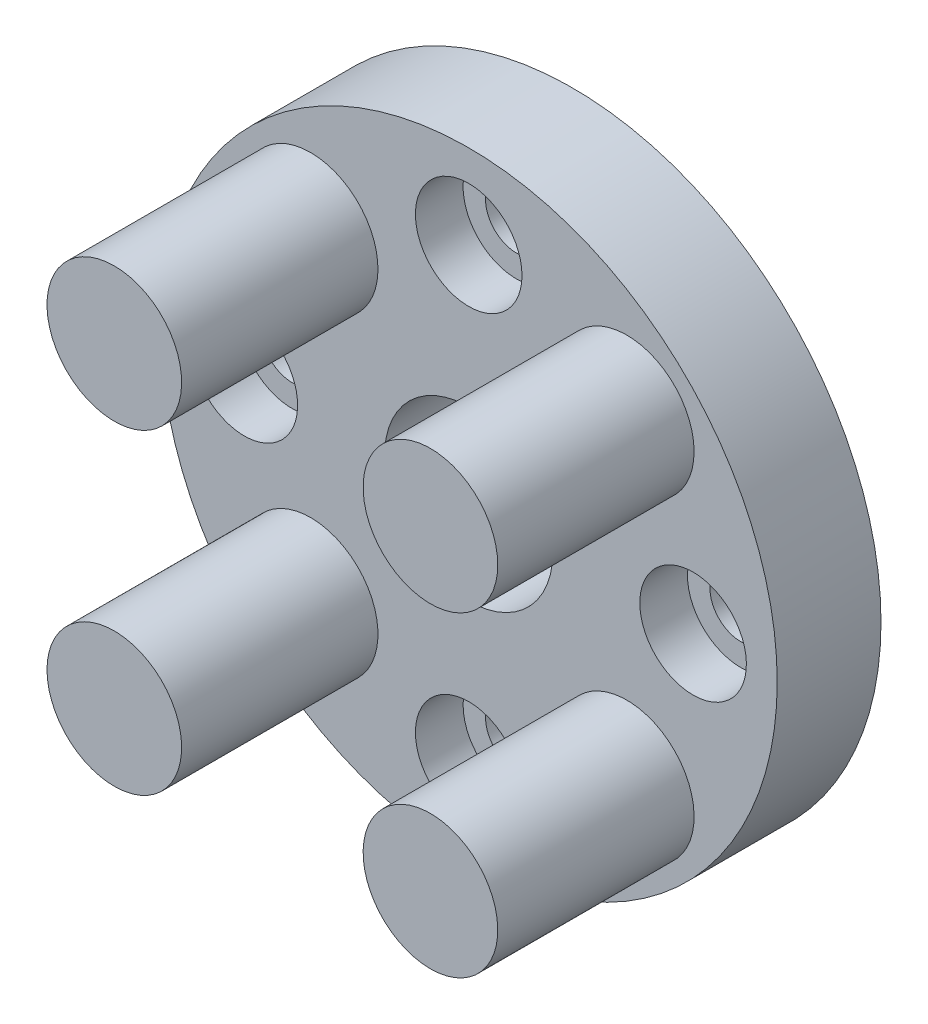
ISO-10303-21;
HEADER;
FILE_DESCRIPTION(('STEP AP214'),'2;1');
FILE_NAME('part.step','',(''),(''),'','','');
FILE_SCHEMA(('AUTOMOTIVE_DESIGN { 1 0 10303 214 1 1 1 1 }'));
ENDSEC;
DATA;
#1=APPLICATION_CONTEXT('core data for automotive mechanical design processes');
#2=APPLICATION_PROTOCOL_DEFINITION('international standard','automotive_design',2000,#1);
#3=PRODUCT_CONTEXT('',#1,'mechanical');
#4=PRODUCT('Part','Part','',(#3));
#5=PRODUCT_RELATED_PRODUCT_CATEGORY('part','',(#4));
#6=PRODUCT_DEFINITION_FORMATION('','',#4);
#7=PRODUCT_DEFINITION_CONTEXT('part definition',#1,'design');
#8=PRODUCT_DEFINITION('design','',#6,#7);
#9=PRODUCT_DEFINITION_SHAPE('','',#8);
#10=(LENGTH_UNIT() NAMED_UNIT(*) SI_UNIT(.MILLI.,.METRE.));
#11=(NAMED_UNIT(*) PLANE_ANGLE_UNIT() SI_UNIT($,.RADIAN.));
#12=(NAMED_UNIT(*) SI_UNIT($,.STERADIAN.) SOLID_ANGLE_UNIT());
#13=UNCERTAINTY_MEASURE_WITH_UNIT(LENGTH_MEASURE(1.E-05),#10,'distance_accuracy_value','');
#14=(GEOMETRIC_REPRESENTATION_CONTEXT(3) GLOBAL_UNCERTAINTY_ASSIGNED_CONTEXT((#13)) GLOBAL_UNIT_ASSIGNED_CONTEXT((#10,
#11,#12)) REPRESENTATION_CONTEXT('',''));
#15=CARTESIAN_POINT('',(0.,0.,0.));
#16=DIRECTION('',(0.,0.,1.));
#17=DIRECTION('',(1.,0.,0.));
#18=AXIS2_PLACEMENT_3D('',#15,#16,#17);
#19=CARTESIAN_POINT('',(8.,0.,3.7));
#20=DIRECTION('',(0.,0.,-1.));
#21=DIRECTION('',(-1.,0.,0.));
#22=AXIS2_PLACEMENT_3D('',#19,#20,#21);
#23=CYLINDRICAL_SURFACE('',#22,1.1);
#24=CARTESIAN_POINT('',(8.,0.,0.));
#25=DIRECTION('',(0.,0.,1.));
#26=DIRECTION('',(1.,0.,0.));
#27=AXIS2_PLACEMENT_3D('',#24,#25,#26);
#28=CIRCLE('',#27,1.1);
#29=CARTESIAN_POINT('',(9.1,0.,0.));
#30=VERTEX_POINT('',#29);
#31=EDGE_CURVE('E106',#30,#30,#28,.T.);
#32=ORIENTED_EDGE('',*,*,#31,.F.);
#33=EDGE_LOOP('',(#32));
#34=FACE_BOUND('',#33,.T.);
#35=CARTESIAN_POINT('',(8.,0.,2.));
#36=DIRECTION('',(0.,0.,1.));
#37=DIRECTION('',(1.,0.,0.));
#38=AXIS2_PLACEMENT_3D('',#35,#36,#37);
#39=CIRCLE('',#38,1.1);
#40=CARTESIAN_POINT('',(9.1,0.,2.));
#41=VERTEX_POINT('',#40);
#42=EDGE_CURVE('E43',#41,#41,#39,.T.);
#43=ORIENTED_EDGE('',*,*,#42,.T.);
#44=EDGE_LOOP('',(#43));
#45=FACE_BOUND('',#44,.T.);
#46=ADVANCED_FACE('F39',(#34,#45),#23,.F.);
#47=CARTESIAN_POINT('',(0.,-8.,3.7));
#48=DIRECTION('',(0.,0.,-1.));
#49=DIRECTION('',(-1.,0.,0.));
#50=AXIS2_PLACEMENT_3D('',#47,#48,#49);
#51=CYLINDRICAL_SURFACE('',#50,1.1);
#52=CARTESIAN_POINT('',(0.,-8.,0.));
#53=DIRECTION('',(0.,0.,1.));
#54=DIRECTION('',(1.,0.,0.));
#55=AXIS2_PLACEMENT_3D('',#52,#53,#54);
#56=CIRCLE('',#55,1.1);
#57=CARTESIAN_POINT('',(1.1,-8.,0.));
#58=VERTEX_POINT('',#57);
#59=EDGE_CURVE('E98',#58,#58,#56,.T.);
#60=ORIENTED_EDGE('',*,*,#59,.F.);
#61=EDGE_LOOP('',(#60));
#62=FACE_BOUND('',#61,.T.);
#63=CARTESIAN_POINT('',(0.,-8.,2.));
#64=DIRECTION('',(0.,0.,1.));
#65=DIRECTION('',(1.,0.,0.));
#66=AXIS2_PLACEMENT_3D('',#63,#64,#65);
#67=CIRCLE('',#66,1.1);
#68=CARTESIAN_POINT('',(1.1,-8.,2.));
#69=VERTEX_POINT('',#68);
#70=EDGE_CURVE('E126',#69,#69,#67,.T.);
#71=ORIENTED_EDGE('',*,*,#70,.T.);
#72=EDGE_LOOP('',(#71));
#73=FACE_BOUND('',#72,.T.);
#74=ADVANCED_FACE('F188',(#62,#73),#51,.F.);
#75=CARTESIAN_POINT('',(-8.,0.,3.7));
#76=DIRECTION('',(0.,0.,-1.));
#77=DIRECTION('',(-1.,0.,0.));
#78=AXIS2_PLACEMENT_3D('',#75,#76,#77);
#79=CYLINDRICAL_SURFACE('',#78,1.1);
#80=CARTESIAN_POINT('',(-8.,0.,0.));
#81=DIRECTION('',(0.,0.,1.));
#82=DIRECTION('',(1.,0.,0.));
#83=AXIS2_PLACEMENT_3D('',#80,#81,#82);
#84=CIRCLE('',#83,1.1);
#85=CARTESIAN_POINT('',(-6.9,0.,0.));
#86=VERTEX_POINT('',#85);
#87=EDGE_CURVE('E94',#86,#86,#84,.T.);
#88=ORIENTED_EDGE('',*,*,#87,.F.);
#89=EDGE_LOOP('',(#88));
#90=FACE_BOUND('',#89,.T.);
#91=CARTESIAN_POINT('',(-8.,0.,2.));
#92=DIRECTION('',(0.,0.,1.));
#93=DIRECTION('',(1.,0.,0.));
#94=AXIS2_PLACEMENT_3D('',#91,#92,#93);
#95=CIRCLE('',#94,1.1);
#96=CARTESIAN_POINT('',(-6.9,0.,2.));
#97=VERTEX_POINT('',#96);
#98=EDGE_CURVE('E64',#97,#97,#95,.T.);
#99=ORIENTED_EDGE('',*,*,#98,.T.);
#100=EDGE_LOOP('',(#99));
#101=FACE_BOUND('',#100,.T.);
#102=ADVANCED_FACE('F185',(#90,#101),#79,.F.);
#103=CARTESIAN_POINT('',(0.,8.,3.7));
#104=DIRECTION('',(0.,0.,-1.));
#105=DIRECTION('',(-1.,0.,0.));
#106=AXIS2_PLACEMENT_3D('',#103,#104,#105);
#107=CYLINDRICAL_SURFACE('',#106,1.1);
#108=CARTESIAN_POINT('',(0.,8.,0.));
#109=DIRECTION('',(0.,0.,1.));
#110=DIRECTION('',(1.,0.,0.));
#111=AXIS2_PLACEMENT_3D('',#108,#109,#110);
#112=CIRCLE('',#111,1.1);
#113=CARTESIAN_POINT('',(1.1,8.,0.));
#114=VERTEX_POINT('',#113);
#115=EDGE_CURVE('E102',#114,#114,#112,.T.);
#116=ORIENTED_EDGE('',*,*,#115,.F.);
#117=EDGE_LOOP('',(#116));
#118=FACE_BOUND('',#117,.T.);
#119=CARTESIAN_POINT('',(0.,8.,2.));
#120=DIRECTION('',(0.,0.,1.));
#121=DIRECTION('',(1.,0.,0.));
#122=AXIS2_PLACEMENT_3D('',#119,#120,#121);
#123=CIRCLE('',#122,1.1);
#124=CARTESIAN_POINT('',(1.1,8.,2.));
#125=VERTEX_POINT('',#124);
#126=EDGE_CURVE('E89',#125,#125,#123,.T.);
#127=ORIENTED_EDGE('',*,*,#126,.T.);
#128=EDGE_LOOP('',(#127));
#129=FACE_BOUND('',#128,.T.);
#130=ADVANCED_FACE('F154',(#118,#129),#107,.F.);
#131=CARTESIAN_POINT('',(0.,0.,3.7));
#132=DIRECTION('',(0.,0.,1.));
#133=DIRECTION('',(1.,0.,0.));
#134=AXIS2_PLACEMENT_3D('',#131,#132,#133);
#135=PLANE('',#134);
#136=CARTESIAN_POINT('',(-5.63564104605673,5.63564104605683,3.7));
#137=DIRECTION('',(0.,0.,1.));
#138=DIRECTION('',(0.,1.,0.));
#139=AXIS2_PLACEMENT_3D('',#136,#137,#138);
#140=CIRCLE('',#139,2.4);
#141=CARTESIAN_POINT('',(-5.63564104605671,8.03564104605683,3.7));
#142=VERTEX_POINT('',#141);
#143=EDGE_CURVE('E387',#142,#142,#140,.T.);
#144=ORIENTED_EDGE('',*,*,#143,.F.);
#145=EDGE_LOOP('',(#144));
#146=FACE_BOUND('',#145,.T.);
#147=CARTESIAN_POINT('',(-5.63564104605677,-5.63564104605679,3.7));
#148=DIRECTION('',(0.,0.,1.));
#149=DIRECTION('',(-1.,0.,0.));
#150=AXIS2_PLACEMENT_3D('',#147,#148,#149);
#151=CIRCLE('',#150,2.4);
#152=CARTESIAN_POINT('',(-8.03564104605677,-5.63564104605679,3.7));
#153=VERTEX_POINT('',#152);
#154=EDGE_CURVE('E386',#153,#153,#151,.T.);
#155=ORIENTED_EDGE('',*,*,#154,.F.);
#156=EDGE_LOOP('',(#155));
#157=FACE_BOUND('',#156,.T.);
#158=CARTESIAN_POINT('',(5.63564104605677,-5.63564104605679,3.7));
#159=DIRECTION('',(0.,0.,1.));
#160=DIRECTION('',(0.,-1.,0.));
#161=AXIS2_PLACEMENT_3D('',#158,#159,#160);
#162=CIRCLE('',#161,2.4);
#163=CARTESIAN_POINT('',(5.63564104605677,-8.03564104605679,3.7));
#164=VERTEX_POINT('',#163);
#165=EDGE_CURVE('E399',#164,#164,#162,.T.);
#166=ORIENTED_EDGE('',*,*,#165,.F.);
#167=EDGE_LOOP('',(#166));
#168=FACE_BOUND('',#167,.T.);
#169=CARTESIAN_POINT('',(5.63564104605677,5.63564104605679,3.7));
#170=DIRECTION('',(0.,0.,1.));
#171=DIRECTION('',(1.,0.,0.));
#172=AXIS2_PLACEMENT_3D('',#169,#170,#171);
#173=CIRCLE('',#172,2.4);
#174=CARTESIAN_POINT('',(8.03564104605677,5.63564104605679,3.7));
#175=VERTEX_POINT('',#174);
#176=EDGE_CURVE('E10',#175,#175,#173,.T.);
#177=ORIENTED_EDGE('',*,*,#176,.F.);
#178=EDGE_LOOP('',(#177));
#179=FACE_BOUND('',#178,.T.);
#180=CARTESIAN_POINT('',(8.,0.,3.7));
#181=DIRECTION('',(0.,0.,1.));
#182=DIRECTION('',(0.,-1.,0.));
#183=AXIS2_PLACEMENT_3D('',#180,#181,#182);
#184=CIRCLE('',#183,1.9);
#185=CARTESIAN_POINT('',(7.99999999999999,-1.90000000000003,3.7));
#186=VERTEX_POINT('',#185);
#187=EDGE_CURVE('E65',#186,#186,#184,.T.);
#188=ORIENTED_EDGE('',*,*,#187,.F.);
#189=EDGE_LOOP('',(#188));
#190=FACE_BOUND('',#189,.T.);
#191=CARTESIAN_POINT('',(0.,-8.,3.7));
#192=DIRECTION('',(0.,0.,1.));
#193=DIRECTION('',(-1.,0.,0.));
#194=AXIS2_PLACEMENT_3D('',#191,#192,#193);
#195=CIRCLE('',#194,1.9);
#196=CARTESIAN_POINT('',(-1.9,-8.,3.7));
#197=VERTEX_POINT('',#196);
#198=EDGE_CURVE('E73',#197,#197,#195,.T.);
#199=ORIENTED_EDGE('',*,*,#198,.F.);
#200=EDGE_LOOP('',(#199));
#201=FACE_BOUND('',#200,.T.);
#202=CARTESIAN_POINT('',(-8.,0.,3.7));
#203=DIRECTION('',(0.,0.,1.));
#204=DIRECTION('',(0.,1.,0.));
#205=AXIS2_PLACEMENT_3D('',#202,#203,#204);
#206=CIRCLE('',#205,1.9);
#207=CARTESIAN_POINT('',(-7.99999999999998,1.90000000000008,3.7));
#208=VERTEX_POINT('',#207);
#209=EDGE_CURVE('E81',#208,#208,#206,.T.);
#210=ORIENTED_EDGE('',*,*,#209,.F.);
#211=EDGE_LOOP('',(#210));
#212=FACE_BOUND('',#211,.T.);
#213=CARTESIAN_POINT('',(0.,8.,3.7));
#214=DIRECTION('',(0.,0.,1.));
#215=DIRECTION('',(1.,0.,0.));
#216=AXIS2_PLACEMENT_3D('',#213,#214,#215);
#217=CIRCLE('',#216,1.9);
#218=CARTESIAN_POINT('',(1.9,8.,3.7));
#219=VERTEX_POINT('',#218);
#220=EDGE_CURVE('E90',#219,#219,#217,.T.);
#221=ORIENTED_EDGE('',*,*,#220,.F.);
#222=EDGE_LOOP('',(#221));
#223=FACE_BOUND('',#222,.T.);
#224=CARTESIAN_POINT('',(0.,0.,3.7));
#225=DIRECTION('',(0.,0.,1.));
#226=DIRECTION('',(1.,0.,0.));
#227=AXIS2_PLACEMENT_3D('',#224,#225,#226);
#228=CIRCLE('',#227,11.);
#229=CARTESIAN_POINT('',(11.,0.,3.7));
#230=VERTEX_POINT('',#229);
#231=EDGE_CURVE('E48',#230,#230,#228,.T.);
#232=ORIENTED_EDGE('',*,*,#231,.T.);
#233=EDGE_LOOP('',(#232));
#234=FACE_BOUND('',#233,.T.);
#235=CARTESIAN_POINT('',(0.,0.,3.7));
#236=DIRECTION('',(0.,0.,1.));
#237=DIRECTION('',(1.,0.,0.));
#238=AXIS2_PLACEMENT_3D('',#235,#236,#237);
#239=CIRCLE('',#238,3.);
#240=CARTESIAN_POINT('',(3.,0.,3.7));
#241=VERTEX_POINT('',#240);
#242=EDGE_CURVE('E111',#241,#241,#239,.T.);
#243=ORIENTED_EDGE('',*,*,#242,.F.);
#244=EDGE_LOOP('',(#243));
#245=FACE_BOUND('',#244,.T.);
#246=ADVANCED_FACE('F150',(#146,#157,#168,#179,#190,#201,#212,#223,#234,#245),#135,.T.);
#247=CARTESIAN_POINT('',(0.,0.,0.));
#248=DIRECTION('',(0.,0.,1.));
#249=DIRECTION('',(1.,0.,0.));
#250=AXIS2_PLACEMENT_3D('',#247,#248,#249);
#251=PLANE('',#250);
#252=CARTESIAN_POINT('',(0.,0.,0.));
#253=DIRECTION('',(0.,0.,1.));
#254=DIRECTION('',(1.,0.,0.));
#255=AXIS2_PLACEMENT_3D('',#252,#253,#254);
#256=CIRCLE('',#255,11.);
#257=CARTESIAN_POINT('',(11.,0.,0.));
#258=VERTEX_POINT('',#257);
#259=EDGE_CURVE('E54',#258,#258,#256,.T.);
#260=ORIENTED_EDGE('',*,*,#259,.F.);
#261=EDGE_LOOP('',(#260));
#262=FACE_BOUND('',#261,.T.);
#263=CARTESIAN_POINT('',(0.,0.,0.));
#264=DIRECTION('',(0.,0.,1.));
#265=DIRECTION('',(1.,0.,0.));
#266=AXIS2_PLACEMENT_3D('',#263,#264,#265);
#267=CIRCLE('',#266,3.);
#268=CARTESIAN_POINT('',(3.,0.,0.));
#269=VERTEX_POINT('',#268);
#270=EDGE_CURVE('E110',#269,#269,#267,.T.);
#271=ORIENTED_EDGE('',*,*,#270,.T.);
#272=EDGE_LOOP('',(#271));
#273=FACE_BOUND('',#272,.T.);
#274=ORIENTED_EDGE('',*,*,#31,.T.);
#275=EDGE_LOOP('',(#274));
#276=FACE_BOUND('',#275,.T.);
#277=ORIENTED_EDGE('',*,*,#115,.T.);
#278=EDGE_LOOP('',(#277));
#279=FACE_BOUND('',#278,.T.);
#280=ORIENTED_EDGE('',*,*,#59,.T.);
#281=EDGE_LOOP('',(#280));
#282=FACE_BOUND('',#281,.T.);
#283=ORIENTED_EDGE('',*,*,#87,.T.);
#284=EDGE_LOOP('',(#283));
#285=FACE_BOUND('',#284,.T.);
#286=ADVANCED_FACE('F153',(#262,#273,#276,#279,#282,#285),#251,.F.);
#287=CARTESIAN_POINT('',(0.,0.,3.7));
#288=DIRECTION('',(0.,0.,-1.));
#289=DIRECTION('',(-1.,0.,0.));
#290=AXIS2_PLACEMENT_3D('',#287,#288,#289);
#291=CYLINDRICAL_SURFACE('',#290,11.);
#292=ORIENTED_EDGE('',*,*,#231,.F.);
#293=EDGE_LOOP('',(#292));
#294=FACE_BOUND('',#293,.T.);
#295=ORIENTED_EDGE('',*,*,#259,.T.);
#296=EDGE_LOOP('',(#295));
#297=FACE_BOUND('',#296,.T.);
#298=ADVANCED_FACE('F41',(#294,#297),#291,.T.);
#299=CARTESIAN_POINT('',(0.,0.,3.7));
#300=DIRECTION('',(0.,0.,-1.));
#301=DIRECTION('',(-1.,0.,0.));
#302=AXIS2_PLACEMENT_3D('',#299,#300,#301);
#303=CYLINDRICAL_SURFACE('',#302,3.);
#304=ORIENTED_EDGE('',*,*,#242,.T.);
#305=EDGE_LOOP('',(#304));
#306=FACE_BOUND('',#305,.T.);
#307=ORIENTED_EDGE('',*,*,#270,.F.);
#308=EDGE_LOOP('',(#307));
#309=FACE_BOUND('',#308,.T.);
#310=ADVANCED_FACE('F167',(#306,#309),#303,.F.);
#311=CARTESIAN_POINT('',(0.,8.,2.));
#312=DIRECTION('',(0.,0.,1.));
#313=DIRECTION('',(1.,0.,0.));
#314=AXIS2_PLACEMENT_3D('',#311,#312,#313);
#315=CYLINDRICAL_SURFACE('',#314,1.9);
#316=CARTESIAN_POINT('',(0.,8.,2.));
#317=DIRECTION('',(0.,0.,1.));
#318=DIRECTION('',(1.,0.,0.));
#319=AXIS2_PLACEMENT_3D('',#316,#317,#318);
#320=CIRCLE('',#319,1.9);
#321=CARTESIAN_POINT('',(1.9,8.,2.));
#322=VERTEX_POINT('',#321);
#323=EDGE_CURVE('E85',#322,#322,#320,.T.);
#324=ORIENTED_EDGE('',*,*,#323,.F.);
#325=EDGE_LOOP('',(#324));
#326=FACE_BOUND('',#325,.T.);
#327=ORIENTED_EDGE('',*,*,#220,.T.);
#328=EDGE_LOOP('',(#327));
#329=FACE_BOUND('',#328,.T.);
#330=ADVANCED_FACE('F170',(#326,#329),#315,.F.);
#331=CARTESIAN_POINT('',(0.,8.,2.));
#332=DIRECTION('',(0.,0.,1.));
#333=DIRECTION('',(1.,0.,0.));
#334=AXIS2_PLACEMENT_3D('',#331,#332,#333);
#335=PLANE('',#334);
#336=ORIENTED_EDGE('',*,*,#126,.F.);
#337=EDGE_LOOP('',(#336));
#338=FACE_BOUND('',#337,.T.);
#339=ORIENTED_EDGE('',*,*,#323,.T.);
#340=EDGE_LOOP('',(#339));
#341=FACE_BOUND('',#340,.T.);
#342=ADVANCED_FACE('F202',(#338,#341),#335,.T.);
#343=CARTESIAN_POINT('',(-8.,0.,2.));
#344=DIRECTION('',(0.,0.,1.));
#345=DIRECTION('',(1.,0.,0.));
#346=AXIS2_PLACEMENT_3D('',#343,#344,#345);
#347=CYLINDRICAL_SURFACE('',#346,1.9);
#348=CARTESIAN_POINT('',(-8.,0.,2.));
#349=DIRECTION('',(0.,0.,1.));
#350=DIRECTION('',(0.,1.,0.));
#351=AXIS2_PLACEMENT_3D('',#348,#349,#350);
#352=CIRCLE('',#351,1.9);
#353=CARTESIAN_POINT('',(-7.99999999999998,1.90000000000008,2.));
#354=VERTEX_POINT('',#353);
#355=EDGE_CURVE('E77',#354,#354,#352,.T.);
#356=ORIENTED_EDGE('',*,*,#355,.F.);
#357=EDGE_LOOP('',(#356));
#358=FACE_BOUND('',#357,.T.);
#359=ORIENTED_EDGE('',*,*,#209,.T.);
#360=EDGE_LOOP('',(#359));
#361=FACE_BOUND('',#360,.T.);
#362=ADVANCED_FACE('F196',(#358,#361),#347,.F.);
#363=CARTESIAN_POINT('',(-8.,0.,2.));
#364=DIRECTION('',(0.,0.,1.));
#365=DIRECTION('',(0.,1.,0.));
#366=AXIS2_PLACEMENT_3D('',#363,#364,#365);
#367=PLANE('',#366);
#368=ORIENTED_EDGE('',*,*,#98,.F.);
#369=EDGE_LOOP('',(#368));
#370=FACE_BOUND('',#369,.T.);
#371=ORIENTED_EDGE('',*,*,#355,.T.);
#372=EDGE_LOOP('',(#371));
#373=FACE_BOUND('',#372,.T.);
#374=ADVANCED_FACE('F192',(#370,#373),#367,.T.);
#375=CARTESIAN_POINT('',(0.,-8.,2.));
#376=DIRECTION('',(0.,0.,1.));
#377=DIRECTION('',(1.,0.,0.));
#378=AXIS2_PLACEMENT_3D('',#375,#376,#377);
#379=CYLINDRICAL_SURFACE('',#378,1.9);
#380=CARTESIAN_POINT('',(0.,-8.,2.));
#381=DIRECTION('',(0.,0.,1.));
#382=DIRECTION('',(-1.,0.,0.));
#383=AXIS2_PLACEMENT_3D('',#380,#381,#382);
#384=CIRCLE('',#383,1.9);
#385=CARTESIAN_POINT('',(-1.9,-8.,2.));
#386=VERTEX_POINT('',#385);
#387=EDGE_CURVE('E69',#386,#386,#384,.T.);
#388=ORIENTED_EDGE('',*,*,#387,.F.);
#389=EDGE_LOOP('',(#388));
#390=FACE_BOUND('',#389,.T.);
#391=ORIENTED_EDGE('',*,*,#198,.T.);
#392=EDGE_LOOP('',(#391));
#393=FACE_BOUND('',#392,.T.);
#394=ADVANCED_FACE('F195',(#390,#393),#379,.F.);
#395=CARTESIAN_POINT('',(0.,-8.,2.));
#396=DIRECTION('',(0.,0.,1.));
#397=DIRECTION('',(-1.,0.,0.));
#398=AXIS2_PLACEMENT_3D('',#395,#396,#397);
#399=PLANE('',#398);
#400=ORIENTED_EDGE('',*,*,#70,.F.);
#401=EDGE_LOOP('',(#400));
#402=FACE_BOUND('',#401,.T.);
#403=ORIENTED_EDGE('',*,*,#387,.T.);
#404=EDGE_LOOP('',(#403));
#405=FACE_BOUND('',#404,.T.);
#406=ADVANCED_FACE('F146',(#402,#405),#399,.T.);
#407=CARTESIAN_POINT('',(8.,0.,2.));
#408=DIRECTION('',(0.,0.,1.));
#409=DIRECTION('',(1.,0.,0.));
#410=AXIS2_PLACEMENT_3D('',#407,#408,#409);
#411=CYLINDRICAL_SURFACE('',#410,1.9);
#412=CARTESIAN_POINT('',(8.,0.,2.));
#413=DIRECTION('',(0.,0.,1.));
#414=DIRECTION('',(0.,-1.,0.));
#415=AXIS2_PLACEMENT_3D('',#412,#413,#414);
#416=CIRCLE('',#415,1.9);
#417=CARTESIAN_POINT('',(7.99999999999999,-1.90000000000003,2.));
#418=VERTEX_POINT('',#417);
#419=EDGE_CURVE('E60',#418,#418,#416,.T.);
#420=ORIENTED_EDGE('',*,*,#419,.F.);
#421=EDGE_LOOP('',(#420));
#422=FACE_BOUND('',#421,.T.);
#423=ORIENTED_EDGE('',*,*,#187,.T.);
#424=EDGE_LOOP('',(#423));
#425=FACE_BOUND('',#424,.T.);
#426=ADVANCED_FACE('F140',(#422,#425),#411,.F.);
#427=CARTESIAN_POINT('',(8.,0.,2.));
#428=DIRECTION('',(0.,0.,1.));
#429=DIRECTION('',(0.,-1.,0.));
#430=AXIS2_PLACEMENT_3D('',#427,#428,#429);
#431=PLANE('',#430);
#432=ORIENTED_EDGE('',*,*,#42,.F.);
#433=EDGE_LOOP('',(#432));
#434=FACE_BOUND('',#433,.T.);
#435=ORIENTED_EDGE('',*,*,#419,.T.);
#436=EDGE_LOOP('',(#435));
#437=FACE_BOUND('',#436,.T.);
#438=ADVANCED_FACE('F136',(#434,#437),#431,.T.);
#439=CARTESIAN_POINT('',(5.63564104605677,5.63564104605679,10.7));
#440=DIRECTION('',(0.,0.,-1.));
#441=DIRECTION('',(-1.,0.,0.));
#442=AXIS2_PLACEMENT_3D('',#439,#440,#441);
#443=CYLINDRICAL_SURFACE('',#442,2.4);
#444=CARTESIAN_POINT('',(5.63564104605677,5.63564104605679,10.7));
#445=DIRECTION('',(0.,0.,1.));
#446=DIRECTION('',(1.,0.,0.));
#447=AXIS2_PLACEMENT_3D('',#444,#445,#446);
#448=CIRCLE('',#447,2.4);
#449=CARTESIAN_POINT('',(8.03564104605677,5.63564104605679,10.7));
#450=VERTEX_POINT('',#449);
#451=EDGE_CURVE('E58',#450,#450,#448,.T.);
#452=ORIENTED_EDGE('',*,*,#451,.F.);
#453=EDGE_LOOP('',(#452));
#454=FACE_BOUND('',#453,.T.);
#455=ORIENTED_EDGE('',*,*,#176,.T.);
#456=EDGE_LOOP('',(#455));
#457=FACE_BOUND('',#456,.T.);
#458=ADVANCED_FACE('F139',(#454,#457),#443,.T.);
#459=CARTESIAN_POINT('',(5.63564104605677,5.63564104605679,10.7));
#460=DIRECTION('',(0.,0.,1.));
#461=DIRECTION('',(1.,0.,0.));
#462=AXIS2_PLACEMENT_3D('',#459,#460,#461);
#463=PLANE('',#462);
#464=ORIENTED_EDGE('',*,*,#451,.T.);
#465=EDGE_LOOP('',(#464));
#466=FACE_BOUND('',#465,.T.);
#467=ADVANCED_FACE('F301',(#466),#463,.T.);
#468=CARTESIAN_POINT('',(5.63564104605677,-5.63564104605679,10.7));
#469=DIRECTION('',(0.,0.,-1.));
#470=DIRECTION('',(-1.,0.,0.));
#471=AXIS2_PLACEMENT_3D('',#468,#469,#470);
#472=CYLINDRICAL_SURFACE('',#471,2.4);
#473=CARTESIAN_POINT('',(5.63564104605677,-5.63564104605679,10.7));
#474=DIRECTION('',(0.,0.,1.));
#475=DIRECTION('',(0.,-1.,0.));
#476=AXIS2_PLACEMENT_3D('',#473,#474,#475);
#477=CIRCLE('',#476,2.4);
#478=CARTESIAN_POINT('',(5.63564104605677,-8.03564104605679,10.7));
#479=VERTEX_POINT('',#478);
#480=EDGE_CURVE('E401',#479,#479,#477,.T.);
#481=ORIENTED_EDGE('',*,*,#480,.F.);
#482=EDGE_LOOP('',(#481));
#483=FACE_BOUND('',#482,.T.);
#484=ORIENTED_EDGE('',*,*,#165,.T.);
#485=EDGE_LOOP('',(#484));
#486=FACE_BOUND('',#485,.T.);
#487=ADVANCED_FACE('F311',(#483,#486),#472,.T.);
#488=CARTESIAN_POINT('',(5.63564104605677,-5.63564104605679,10.7));
#489=DIRECTION('',(0.,0.,1.));
#490=DIRECTION('',(0.,-1.,0.));
#491=AXIS2_PLACEMENT_3D('',#488,#489,#490);
#492=PLANE('',#491);
#493=ORIENTED_EDGE('',*,*,#480,.T.);
#494=EDGE_LOOP('',(#493));
#495=FACE_BOUND('',#494,.T.);
#496=ADVANCED_FACE('F328',(#495),#492,.T.);
#497=CARTESIAN_POINT('',(-5.63564104605677,-5.63564104605679,10.7));
#498=DIRECTION('',(0.,0.,-1.));
#499=DIRECTION('',(-1.,0.,0.));
#500=AXIS2_PLACEMENT_3D('',#497,#498,#499);
#501=CYLINDRICAL_SURFACE('',#500,2.4);
#502=CARTESIAN_POINT('',(-5.63564104605677,-5.63564104605679,10.7));
#503=DIRECTION('',(0.,0.,1.));
#504=DIRECTION('',(-1.,0.,0.));
#505=AXIS2_PLACEMENT_3D('',#502,#503,#504);
#506=CIRCLE('',#505,2.4);
#507=CARTESIAN_POINT('',(-8.03564104605677,-5.63564104605679,10.7));
#508=VERTEX_POINT('',#507);
#509=EDGE_CURVE('E392',#508,#508,#506,.T.);
#510=ORIENTED_EDGE('',*,*,#509,.F.);
#511=EDGE_LOOP('',(#510));
#512=FACE_BOUND('',#511,.T.);
#513=ORIENTED_EDGE('',*,*,#154,.T.);
#514=EDGE_LOOP('',(#513));
#515=FACE_BOUND('',#514,.T.);
#516=ADVANCED_FACE('F338',(#512,#515),#501,.T.);
#517=CARTESIAN_POINT('',(-5.63564104605677,-5.63564104605679,10.7));
#518=DIRECTION('',(0.,0.,1.));
#519=DIRECTION('',(-1.,0.,0.));
#520=AXIS2_PLACEMENT_3D('',#517,#518,#519);
#521=PLANE('',#520);
#522=ORIENTED_EDGE('',*,*,#509,.T.);
#523=EDGE_LOOP('',(#522));
#524=FACE_BOUND('',#523,.T.);
#525=ADVANCED_FACE('F348',(#524),#521,.T.);
#526=CARTESIAN_POINT('',(-5.63564104605673,5.63564104605683,10.7));
#527=DIRECTION('',(0.,0.,-1.));
#528=DIRECTION('',(-1.,0.,0.));
#529=AXIS2_PLACEMENT_3D('',#526,#527,#528);
#530=CYLINDRICAL_SURFACE('',#529,2.4);
#531=CARTESIAN_POINT('',(-5.63564104605673,5.63564104605683,10.7));
#532=DIRECTION('',(0.,0.,1.));
#533=DIRECTION('',(0.,1.,0.));
#534=AXIS2_PLACEMENT_3D('',#531,#532,#533);
#535=CIRCLE('',#534,2.4);
#536=CARTESIAN_POINT('',(-5.63564104605671,8.03564104605683,10.7));
#537=VERTEX_POINT('',#536);
#538=EDGE_CURVE('E384',#537,#537,#535,.T.);
#539=ORIENTED_EDGE('',*,*,#538,.F.);
#540=EDGE_LOOP('',(#539));
#541=FACE_BOUND('',#540,.T.);
#542=ORIENTED_EDGE('',*,*,#143,.T.);
#543=EDGE_LOOP('',(#542));
#544=FACE_BOUND('',#543,.T.);
#545=ADVANCED_FACE('F358',(#541,#544),#530,.T.);
#546=CARTESIAN_POINT('',(-5.63564104605673,5.63564104605683,10.7));
#547=DIRECTION('',(0.,0.,1.));
#548=DIRECTION('',(0.,1.,0.));
#549=AXIS2_PLACEMENT_3D('',#546,#547,#548);
#550=PLANE('',#549);
#551=ORIENTED_EDGE('',*,*,#538,.T.);
#552=EDGE_LOOP('',(#551));
#553=FACE_BOUND('',#552,.T.);
#554=ADVANCED_FACE('F368',(#553),#550,.T.);
#555=CLOSED_SHELL('',(#46,#74,#102,#130,#246,#286,#298,#310,#330,#342,#362,#374,#394,#406,#426,
#438,#458,#467,#487,#496,#516,#525,#545,#554));
#556=MANIFOLD_SOLID_BREP('B2',#555);
#557=ADVANCED_BREP_SHAPE_REPRESENTATION('',(#18,#556),#14);
#558=SHAPE_DEFINITION_REPRESENTATION(#9,#557);
ENDSEC;
END-ISO-10303-21;
